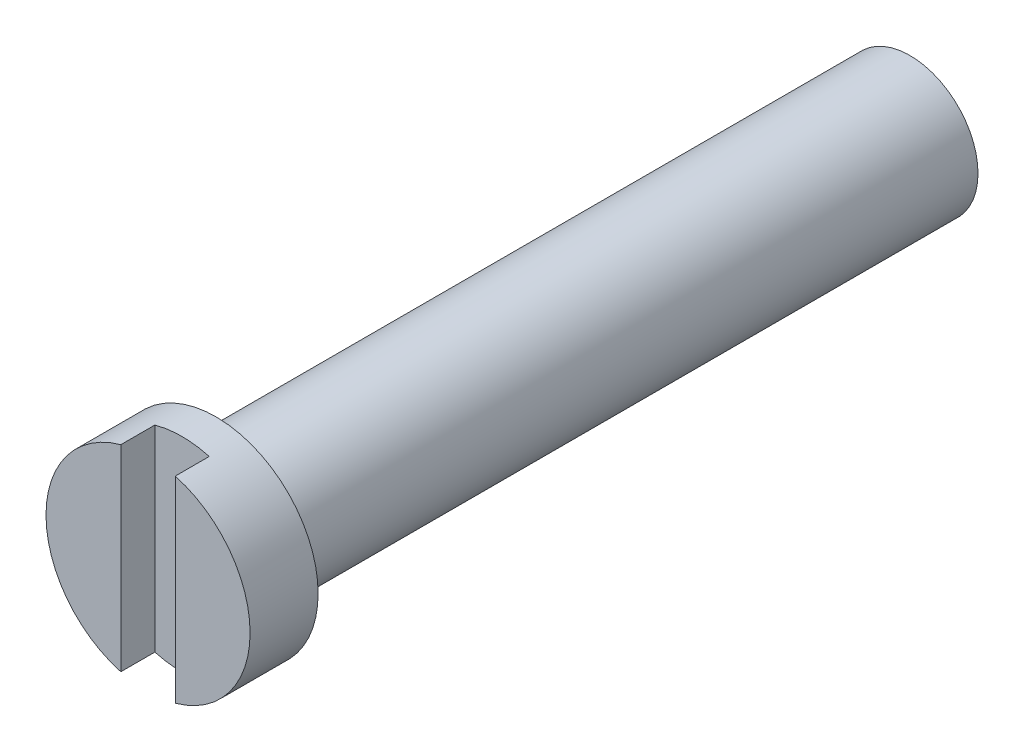
ISO-10303-21;
HEADER;
FILE_DESCRIPTION(('STEP AP214'),'2;1');
FILE_NAME('part.step','',(''),(''),'','','');
FILE_SCHEMA(('AUTOMOTIVE_DESIGN { 1 0 10303 214 1 1 1 1 }'));
ENDSEC;
DATA;
#1=APPLICATION_CONTEXT('core data for automotive mechanical design processes');
#2=APPLICATION_PROTOCOL_DEFINITION('international standard','automotive_design',2000,#1);
#3=PRODUCT_CONTEXT('',#1,'mechanical');
#4=PRODUCT('Part','Part','',(#3));
#5=PRODUCT_RELATED_PRODUCT_CATEGORY('part','',(#4));
#6=PRODUCT_DEFINITION_FORMATION('','',#4);
#7=PRODUCT_DEFINITION_CONTEXT('part definition',#1,'design');
#8=PRODUCT_DEFINITION('design','',#6,#7);
#9=PRODUCT_DEFINITION_SHAPE('','',#8);
#10=(LENGTH_UNIT() NAMED_UNIT(*) SI_UNIT(.MILLI.,.METRE.));
#11=(NAMED_UNIT(*) PLANE_ANGLE_UNIT() SI_UNIT($,.RADIAN.));
#12=(NAMED_UNIT(*) SI_UNIT($,.STERADIAN.) SOLID_ANGLE_UNIT());
#13=UNCERTAINTY_MEASURE_WITH_UNIT(LENGTH_MEASURE(1.E-05),#10,'distance_accuracy_value','');
#14=(GEOMETRIC_REPRESENTATION_CONTEXT(3) GLOBAL_UNCERTAINTY_ASSIGNED_CONTEXT((#13)) GLOBAL_UNIT_ASSIGNED_CONTEXT((#10,
#11,#12)) REPRESENTATION_CONTEXT('',''));
#15=CARTESIAN_POINT('',(0.,0.,0.));
#16=DIRECTION('',(0.,0.,1.));
#17=DIRECTION('',(1.,0.,0.));
#18=AXIS2_PLACEMENT_3D('',#15,#16,#17);
#19=CARTESIAN_POINT('',(0.,0.,11.2));
#20=DIRECTION('',(0.,0.,1.));
#21=DIRECTION('',(1.,0.,0.));
#22=AXIS2_PLACEMENT_3D('',#19,#20,#21);
#23=PLANE('',#22);
#24=DIRECTION('',(0.,1.,0.));
#25=VECTOR('',#24,1.);
#26=CARTESIAN_POINT('',(0.4,1.4456832294801,11.2));
#27=LINE('',#26,#25);
#28=CARTESIAN_POINT('',(0.4,-1.4456832294801,11.2));
#29=VERTEX_POINT('',#28);
#30=CARTESIAN_POINT('',(0.4,1.4456832294801,11.2));
#31=VERTEX_POINT('',#30);
#32=EDGE_CURVE('E72',#29,#31,#27,.T.);
#33=ORIENTED_EDGE('',*,*,#32,.F.);
#34=CARTESIAN_POINT('',(0.,0.,11.2));
#35=DIRECTION('',(0.,0.,1.));
#36=DIRECTION('',(1.,0.,0.));
#37=AXIS2_PLACEMENT_3D('',#34,#35,#36);
#38=CIRCLE('',#37,1.5);
#39=EDGE_CURVE('E109',#29,#31,#38,.T.);
#40=ORIENTED_EDGE('',*,*,#39,.T.);
#41=EDGE_LOOP('',(#33,#40));
#42=FACE_BOUND('',#41,.T.);
#43=ADVANCED_FACE('F34',(#42),#23,.T.);
#44=CARTESIAN_POINT('',(0.,0.,10.2));
#45=DIRECTION('',(0.,0.,-1.));
#46=DIRECTION('',(-1.,0.,0.));
#47=AXIS2_PLACEMENT_3D('',#44,#45,#46);
#48=CYLINDRICAL_SURFACE('',#47,1.);
#49=CARTESIAN_POINT('',(0.,0.,10.2));
#50=DIRECTION('',(0.,0.,1.));
#51=DIRECTION('',(1.,0.,0.));
#52=AXIS2_PLACEMENT_3D('',#49,#50,#51);
#53=CIRCLE('',#52,1.);
#54=CARTESIAN_POINT('',(1.,0.,10.2));
#55=VERTEX_POINT('',#54);
#56=EDGE_CURVE('E11',#55,#55,#53,.T.);
#57=ORIENTED_EDGE('',*,*,#56,.F.);
#58=EDGE_LOOP('',(#57));
#59=FACE_BOUND('',#58,.T.);
#60=CARTESIAN_POINT('',(0.,0.,0.));
#61=DIRECTION('',(0.,0.,1.));
#62=DIRECTION('',(1.,0.,0.));
#63=AXIS2_PLACEMENT_3D('',#60,#61,#62);
#64=CIRCLE('',#63,1.);
#65=CARTESIAN_POINT('',(1.,0.,0.));
#66=VERTEX_POINT('',#65);
#67=EDGE_CURVE('E38',#66,#66,#64,.T.);
#68=ORIENTED_EDGE('',*,*,#67,.T.);
#69=EDGE_LOOP('',(#68));
#70=FACE_BOUND('',#69,.T.);
#71=ADVANCED_FACE('F36',(#59,#70),#48,.T.);
#72=CARTESIAN_POINT('',(0.,0.,0.));
#73=DIRECTION('',(0.,0.,1.));
#74=DIRECTION('',(1.,0.,0.));
#75=AXIS2_PLACEMENT_3D('',#72,#73,#74);
#76=PLANE('',#75);
#77=ORIENTED_EDGE('',*,*,#67,.F.);
#78=EDGE_LOOP('',(#77));
#79=FACE_BOUND('',#78,.T.);
#80=ADVANCED_FACE('F135',(#79),#76,.F.);
#81=CARTESIAN_POINT('',(0.,0.,11.2));
#82=DIRECTION('',(0.,0.,-1.));
#83=DIRECTION('',(-1.,0.,0.));
#84=AXIS2_PLACEMENT_3D('',#81,#82,#83);
#85=CYLINDRICAL_SURFACE('',#84,1.5);
#86=CARTESIAN_POINT('',(0.,0.,10.7));
#87=DIRECTION('',(0.,0.,1.));
#88=DIRECTION('',(1.,0.,0.));
#89=AXIS2_PLACEMENT_3D('',#86,#87,#88);
#90=CIRCLE('',#89,1.5);
#91=CARTESIAN_POINT('',(0.4,1.4456832294801,10.7));
#92=VERTEX_POINT('',#91);
#93=CARTESIAN_POINT('',(-0.4,1.4456832294801,10.7));
#94=VERTEX_POINT('',#93);
#95=EDGE_CURVE('E92',#92,#94,#90,.T.);
#96=ORIENTED_EDGE('',*,*,#95,.F.);
#97=DIRECTION('',(0.,0.,1.));
#98=VECTOR('',#97,1.);
#99=CARTESIAN_POINT('',(0.4,1.4456832294801,10.7));
#100=LINE('',#99,#98);
#101=EDGE_CURVE('E58',#92,#31,#100,.T.);
#102=ORIENTED_EDGE('',*,*,#101,.T.);
#103=ORIENTED_EDGE('',*,*,#39,.F.);
#104=DIRECTION('',(0.,0.,1.));
#105=VECTOR('',#104,1.);
#106=CARTESIAN_POINT('',(0.4,-1.4456832294801,10.7));
#107=LINE('',#106,#105);
#108=CARTESIAN_POINT('',(0.4,-1.4456832294801,10.7));
#109=VERTEX_POINT('',#108);
#110=EDGE_CURVE('E86',#109,#29,#107,.T.);
#111=ORIENTED_EDGE('',*,*,#110,.F.);
#112=CARTESIAN_POINT('',(0.,0.,10.7));
#113=DIRECTION('',(0.,0.,1.));
#114=DIRECTION('',(1.,0.,0.));
#115=AXIS2_PLACEMENT_3D('',#112,#113,#114);
#116=CIRCLE('',#115,1.5);
#117=CARTESIAN_POINT('',(-0.4,-1.4456832294801,10.7));
#118=VERTEX_POINT('',#117);
#119=EDGE_CURVE('E90',#118,#109,#116,.T.);
#120=ORIENTED_EDGE('',*,*,#119,.F.);
#121=DIRECTION('',(0.,0.,1.));
#122=VECTOR('',#121,1.);
#123=CARTESIAN_POINT('',(-0.4,-1.4456832294801,10.7));
#124=LINE('',#123,#122);
#125=CARTESIAN_POINT('',(-0.4,-1.4456832294801,11.2));
#126=VERTEX_POINT('',#125);
#127=EDGE_CURVE('E79',#118,#126,#124,.T.);
#128=ORIENTED_EDGE('',*,*,#127,.T.);
#129=CARTESIAN_POINT('',(-0.4,1.4456832294801,11.2));
#130=VERTEX_POINT('',#129);
#131=EDGE_CURVE('E112',#130,#126,#38,.T.);
#132=ORIENTED_EDGE('',*,*,#131,.F.);
#133=DIRECTION('',(0.,0.,1.));
#134=VECTOR('',#133,1.);
#135=CARTESIAN_POINT('',(-0.4,1.4456832294801,10.7));
#136=LINE('',#135,#134);
#137=EDGE_CURVE('E49',#94,#130,#136,.T.);
#138=ORIENTED_EDGE('',*,*,#137,.F.);
#139=EDGE_LOOP('',(#96,#102,#103,#111,#120,#128,#132,#138));
#140=FACE_BOUND('',#139,.T.);
#141=CARTESIAN_POINT('',(0.,0.,10.2));
#142=DIRECTION('',(0.,0.,1.));
#143=DIRECTION('',(1.,0.,0.));
#144=AXIS2_PLACEMENT_3D('',#141,#142,#143);
#145=CIRCLE('',#144,1.5);
#146=CARTESIAN_POINT('',(1.5,0.,10.2));
#147=VERTEX_POINT('',#146);
#148=EDGE_CURVE('E106',#147,#147,#145,.T.);
#149=ORIENTED_EDGE('',*,*,#148,.T.);
#150=EDGE_LOOP('',(#149));
#151=FACE_BOUND('',#150,.T.);
#152=ADVANCED_FACE('F95',(#140,#151),#85,.T.);
#153=DIRECTION('',(0.,-1.,0.));
#154=VECTOR('',#153,1.);
#155=CARTESIAN_POINT('',(-0.4,1.4456832294801,11.2));
#156=LINE('',#155,#154);
#157=EDGE_CURVE('E81',#130,#126,#156,.T.);
#158=ORIENTED_EDGE('',*,*,#157,.F.);
#159=ORIENTED_EDGE('',*,*,#131,.T.);
#160=EDGE_LOOP('',(#158,#159));
#161=FACE_BOUND('',#160,.T.);
#162=ADVANCED_FACE('F119',(#161),#23,.T.);
#163=CARTESIAN_POINT('',(0.,0.,10.2));
#164=DIRECTION('',(0.,0.,1.));
#165=DIRECTION('',(1.,0.,0.));
#166=AXIS2_PLACEMENT_3D('',#163,#164,#165);
#167=PLANE('',#166);
#168=ORIENTED_EDGE('',*,*,#56,.T.);
#169=EDGE_LOOP('',(#168));
#170=FACE_BOUND('',#169,.T.);
#171=ORIENTED_EDGE('',*,*,#148,.F.);
#172=EDGE_LOOP('',(#171));
#173=FACE_BOUND('',#172,.T.);
#174=ADVANCED_FACE('F116',(#170,#173),#167,.F.);
#175=CARTESIAN_POINT('',(0.4,1.4456832294801,10.7));
#176=DIRECTION('',(1.,0.,0.));
#177=DIRECTION('',(0.,0.,-1.));
#178=AXIS2_PLACEMENT_3D('',#175,#176,#177);
#179=PLANE('',#178);
#180=ORIENTED_EDGE('',*,*,#32,.T.);
#181=ORIENTED_EDGE('',*,*,#101,.F.);
#182=DIRECTION('',(0.,1.,0.));
#183=VECTOR('',#182,1.);
#184=CARTESIAN_POINT('',(0.4,1.4456832294801,10.7));
#185=LINE('',#184,#183);
#186=EDGE_CURVE('E98',#109,#92,#185,.T.);
#187=ORIENTED_EDGE('',*,*,#186,.F.);
#188=ORIENTED_EDGE('',*,*,#110,.T.);
#189=EDGE_LOOP('',(#180,#181,#187,#188));
#190=FACE_BOUND('',#189,.T.);
#191=ADVANCED_FACE('F118',(#190),#179,.F.);
#192=CARTESIAN_POINT('',(-0.4,1.4456832294801,10.7));
#193=DIRECTION('',(-1.,0.,0.));
#194=DIRECTION('',(0.,0.,1.));
#195=AXIS2_PLACEMENT_3D('',#192,#193,#194);
#196=PLANE('',#195);
#197=ORIENTED_EDGE('',*,*,#157,.T.);
#198=ORIENTED_EDGE('',*,*,#127,.F.);
#199=DIRECTION('',(0.,-1.,0.));
#200=VECTOR('',#199,1.);
#201=CARTESIAN_POINT('',(-0.4,1.4456832294801,10.7));
#202=LINE('',#201,#200);
#203=EDGE_CURVE('E76',#94,#118,#202,.T.);
#204=ORIENTED_EDGE('',*,*,#203,.F.);
#205=ORIENTED_EDGE('',*,*,#137,.T.);
#206=EDGE_LOOP('',(#197,#198,#204,#205));
#207=FACE_BOUND('',#206,.T.);
#208=ADVANCED_FACE('F80',(#207),#196,.F.);
#209=CARTESIAN_POINT('',(0.,0.,10.7));
#210=DIRECTION('',(0.,0.,1.));
#211=DIRECTION('',(1.,0.,0.));
#212=AXIS2_PLACEMENT_3D('',#209,#210,#211);
#213=PLANE('',#212);
#214=ORIENTED_EDGE('',*,*,#95,.T.);
#215=ORIENTED_EDGE('',*,*,#203,.T.);
#216=ORIENTED_EDGE('',*,*,#119,.T.);
#217=ORIENTED_EDGE('',*,*,#186,.T.);
#218=EDGE_LOOP('',(#214,#215,#216,#217));
#219=FACE_BOUND('',#218,.T.);
#220=ADVANCED_FACE('F89',(#219),#213,.T.);
#221=CLOSED_SHELL('',(#43,#71,#80,#152,#162,#174,#191,#208,#220));
#222=MANIFOLD_SOLID_BREP('B2',#221);
#223=ADVANCED_BREP_SHAPE_REPRESENTATION('',(#18,#222),#14);
#224=SHAPE_DEFINITION_REPRESENTATION(#9,#223);
ENDSEC;
END-ISO-10303-21;
